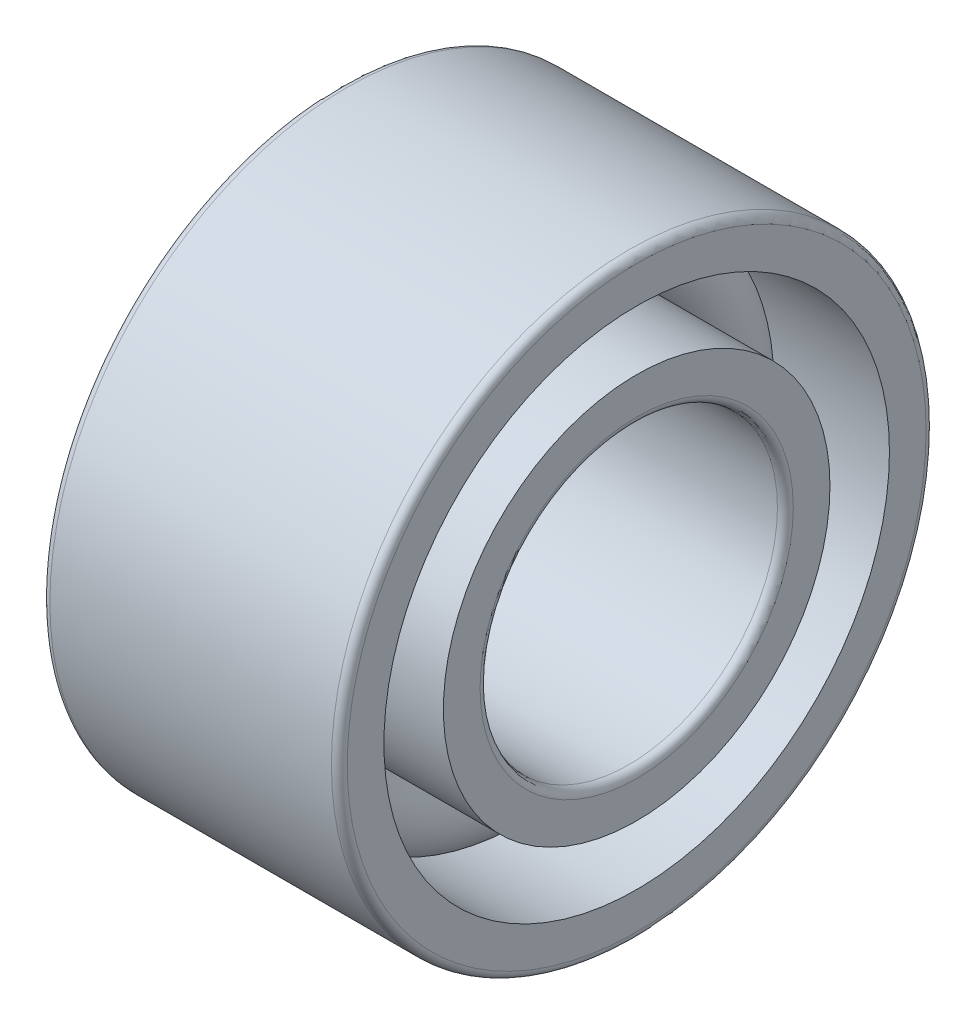
ISO-10303-21;
HEADER;
FILE_DESCRIPTION(('STEP AP214'),'2;1');
FILE_NAME('part.step','',(''),(''),'','','');
FILE_SCHEMA(('AUTOMOTIVE_DESIGN { 1 0 10303 214 1 1 1 1 }'));
ENDSEC;
DATA;
#1=APPLICATION_CONTEXT('core data for automotive mechanical design processes');
#2=APPLICATION_PROTOCOL_DEFINITION('international standard','automotive_design',2000,#1);
#3=PRODUCT_CONTEXT('',#1,'mechanical');
#4=PRODUCT('Part','Part','',(#3));
#5=PRODUCT_RELATED_PRODUCT_CATEGORY('part','',(#4));
#6=PRODUCT_DEFINITION_FORMATION('','',#4);
#7=PRODUCT_DEFINITION_CONTEXT('part definition',#1,'design');
#8=PRODUCT_DEFINITION('design','',#6,#7);
#9=PRODUCT_DEFINITION_SHAPE('','',#8);
#10=(LENGTH_UNIT() NAMED_UNIT(*) SI_UNIT(.MILLI.,.METRE.));
#11=(NAMED_UNIT(*) PLANE_ANGLE_UNIT() SI_UNIT($,.RADIAN.));
#12=(NAMED_UNIT(*) SI_UNIT($,.STERADIAN.) SOLID_ANGLE_UNIT());
#13=UNCERTAINTY_MEASURE_WITH_UNIT(LENGTH_MEASURE(1.E-05),#10,'distance_accuracy_value','');
#14=(GEOMETRIC_REPRESENTATION_CONTEXT(3) GLOBAL_UNCERTAINTY_ASSIGNED_CONTEXT((#13)) GLOBAL_UNIT_ASSIGNED_CONTEXT((#10,
#11,#12)) REPRESENTATION_CONTEXT('',''));
#15=CARTESIAN_POINT('',(0.,0.,0.));
#16=DIRECTION('',(0.,0.,1.));
#17=DIRECTION('',(1.,0.,0.));
#18=AXIS2_PLACEMENT_3D('',#15,#16,#17);
#19=CARTESIAN_POINT('',(0.,0.,0.));
#20=DIRECTION('',(-1.,0.,0.));
#21=DIRECTION('',(0.,0.,1.));
#22=AXIS2_PLACEMENT_3D('',#19,#20,#21);
#23=TOROIDAL_SURFACE('',#22,2.25,0.45);
#24=CARTESIAN_POINT('',(0.335410196624964,0.,0.));
#25=DIRECTION('',(-1.,0.,0.));
#26=DIRECTION('',(0.,0.,1.));
#27=AXIS2_PLACEMENT_3D('',#24,#25,#26);
#28=CIRCLE('',#27,2.55);
#29=CARTESIAN_POINT('',(0.335410196624964,0.,2.55));
#30=VERTEX_POINT('',#29);
#31=EDGE_CURVE('E35',#30,#30,#28,.F.);
#32=ORIENTED_EDGE('',*,*,#31,.T.);
#33=EDGE_LOOP('',(#32));
#34=FACE_BOUND('',#33,.T.);
#35=CARTESIAN_POINT('',(0.335410196624968,0.,0.));
#36=DIRECTION('',(-1.,0.,0.));
#37=DIRECTION('',(0.,0.,1.));
#38=AXIS2_PLACEMENT_3D('',#35,#36,#37);
#39=CIRCLE('',#38,1.95);
#40=CARTESIAN_POINT('',(0.335410196624968,0.,1.95));
#41=VERTEX_POINT('',#40);
#42=EDGE_CURVE('E10',#41,#41,#39,.T.);
#43=ORIENTED_EDGE('',*,*,#42,.T.);
#44=EDGE_LOOP('',(#43));
#45=FACE_BOUND('',#44,.T.);
#46=ADVANCED_FACE('F31',(#34,#45),#23,.T.);
#47=CARTESIAN_POINT('',(-20.6375,0.,0.));
#48=DIRECTION('',(1.,0.,0.));
#49=DIRECTION('',(0.,0.,-1.));
#50=AXIS2_PLACEMENT_3D('',#47,#48,#49);
#51=CYLINDRICAL_SURFACE('',#50,1.95);
#52=CARTESIAN_POINT('',(1.5,0.,0.));
#53=DIRECTION('',(1.,0.,0.));
#54=DIRECTION('',(0.,0.,-1.));
#55=AXIS2_PLACEMENT_3D('',#52,#53,#54);
#56=CIRCLE('',#55,1.95);
#57=CARTESIAN_POINT('',(1.5,0.,-1.95));
#58=VERTEX_POINT('',#57);
#59=EDGE_CURVE('E44',#58,#58,#56,.T.);
#60=ORIENTED_EDGE('',*,*,#59,.F.);
#61=EDGE_LOOP('',(#60));
#62=FACE_BOUND('',#61,.T.);
#63=ORIENTED_EDGE('',*,*,#42,.F.);
#64=EDGE_LOOP('',(#63));
#65=FACE_BOUND('',#64,.T.);
#66=ADVANCED_FACE('F83',(#62,#65),#51,.T.);
#67=CARTESIAN_POINT('',(-20.6375,0.,0.));
#68=DIRECTION('',(1.,0.,0.));
#69=DIRECTION('',(0.,0.,-1.));
#70=AXIS2_PLACEMENT_3D('',#67,#68,#69);
#71=CYLINDRICAL_SURFACE('',#70,1.95);
#72=CARTESIAN_POINT('',(-1.5,0.,0.));
#73=DIRECTION('',(1.,0.,0.));
#74=DIRECTION('',(0.,0.,-1.));
#75=AXIS2_PLACEMENT_3D('',#72,#73,#74);
#76=CIRCLE('',#75,1.95);
#77=CARTESIAN_POINT('',(-1.5,0.,-1.95));
#78=VERTEX_POINT('',#77);
#79=EDGE_CURVE('E53',#78,#78,#76,.T.);
#80=ORIENTED_EDGE('',*,*,#79,.T.);
#81=EDGE_LOOP('',(#80));
#82=FACE_BOUND('',#81,.T.);
#83=CARTESIAN_POINT('',(-0.335410196624968,0.,0.));
#84=DIRECTION('',(1.,0.,0.));
#85=DIRECTION('',(0.,0.,-1.));
#86=AXIS2_PLACEMENT_3D('',#83,#84,#85);
#87=CIRCLE('',#86,1.95);
#88=CARTESIAN_POINT('',(-0.335410196624968,0.,-1.95));
#89=VERTEX_POINT('',#88);
#90=EDGE_CURVE('E39',#89,#89,#87,.T.);
#91=ORIENTED_EDGE('',*,*,#90,.F.);
#92=EDGE_LOOP('',(#91));
#93=FACE_BOUND('',#92,.T.);
#94=ADVANCED_FACE('F86',(#82,#93),#71,.T.);
#95=CARTESIAN_POINT('',(1.5,1.58,0.));
#96=DIRECTION('',(1.,0.,0.));
#97=DIRECTION('',(0.,0.,-1.));
#98=AXIS2_PLACEMENT_3D('',#95,#96,#97);
#99=PLANE('',#98);
#100=ORIENTED_EDGE('',*,*,#59,.T.);
#101=EDGE_LOOP('',(#100));
#102=FACE_BOUND('',#101,.T.);
#103=CARTESIAN_POINT('',(1.5,0.,0.));
#104=DIRECTION('',(1.,0.,0.));
#105=DIRECTION('',(0.,0.,-1.));
#106=AXIS2_PLACEMENT_3D('',#103,#104,#105);
#107=CIRCLE('',#106,1.58);
#108=CARTESIAN_POINT('',(1.5,0.,-1.58));
#109=VERTEX_POINT('',#108);
#110=EDGE_CURVE('E75',#109,#109,#107,.T.);
#111=ORIENTED_EDGE('',*,*,#110,.F.);
#112=EDGE_LOOP('',(#111));
#113=FACE_BOUND('',#112,.T.);
#114=ADVANCED_FACE('F80',(#102,#113),#99,.T.);
#115=CARTESIAN_POINT('',(1.42,0.,0.));
#116=DIRECTION('',(1.,0.,0.));
#117=DIRECTION('',(0.,0.,-1.));
#118=AXIS2_PLACEMENT_3D('',#115,#116,#117);
#119=TOROIDAL_SURFACE('',#118,1.58,0.0800000000000001);
#120=ORIENTED_EDGE('',*,*,#110,.T.);
#121=EDGE_LOOP('',(#120));
#122=FACE_BOUND('',#121,.T.);
#123=CARTESIAN_POINT('',(1.42,0.,0.));
#124=DIRECTION('',(1.,0.,0.));
#125=DIRECTION('',(0.,0.,-1.));
#126=AXIS2_PLACEMENT_3D('',#123,#124,#125);
#127=CIRCLE('',#126,1.5);
#128=CARTESIAN_POINT('',(1.42,0.,-1.5));
#129=VERTEX_POINT('',#128);
#130=EDGE_CURVE('E72',#129,#129,#127,.T.);
#131=ORIENTED_EDGE('',*,*,#130,.F.);
#132=EDGE_LOOP('',(#131));
#133=FACE_BOUND('',#132,.T.);
#134=ADVANCED_FACE('F97',(#122,#133),#119,.T.);
#135=CARTESIAN_POINT('',(-20.6375,0.,0.));
#136=DIRECTION('',(1.,0.,0.));
#137=DIRECTION('',(0.,0.,-1.));
#138=AXIS2_PLACEMENT_3D('',#135,#136,#137);
#139=CYLINDRICAL_SURFACE('',#138,1.5);
#140=ORIENTED_EDGE('',*,*,#130,.T.);
#141=EDGE_LOOP('',(#140));
#142=FACE_BOUND('',#141,.T.);
#143=CARTESIAN_POINT('',(-1.42,0.,0.));
#144=DIRECTION('',(1.,0.,0.));
#145=DIRECTION('',(0.,0.,-1.));
#146=AXIS2_PLACEMENT_3D('',#143,#144,#145);
#147=CIRCLE('',#146,1.5);
#148=CARTESIAN_POINT('',(-1.42,0.,-1.5));
#149=VERTEX_POINT('',#148);
#150=EDGE_CURVE('E69',#149,#149,#147,.T.);
#151=ORIENTED_EDGE('',*,*,#150,.F.);
#152=EDGE_LOOP('',(#151));
#153=FACE_BOUND('',#152,.T.);
#154=ADVANCED_FACE('F100',(#142,#153),#139,.F.);
#155=CARTESIAN_POINT('',(-1.42,0.,0.));
#156=DIRECTION('',(1.,0.,0.));
#157=DIRECTION('',(0.,0.,-1.));
#158=AXIS2_PLACEMENT_3D('',#155,#156,#157);
#159=TOROIDAL_SURFACE('',#158,1.58,0.0800000000000001);
#160=ORIENTED_EDGE('',*,*,#150,.T.);
#161=EDGE_LOOP('',(#160));
#162=FACE_BOUND('',#161,.T.);
#163=CARTESIAN_POINT('',(-1.5,0.,0.));
#164=DIRECTION('',(1.,0.,0.));
#165=DIRECTION('',(0.,0.,-1.));
#166=AXIS2_PLACEMENT_3D('',#163,#164,#165);
#167=CIRCLE('',#166,1.58);
#168=CARTESIAN_POINT('',(-1.5,0.,-1.58));
#169=VERTEX_POINT('',#168);
#170=EDGE_CURVE('E66',#169,#169,#167,.T.);
#171=ORIENTED_EDGE('',*,*,#170,.F.);
#172=EDGE_LOOP('',(#171));
#173=FACE_BOUND('',#172,.T.);
#174=ADVANCED_FACE('F104',(#162,#173),#159,.T.);
#175=CARTESIAN_POINT('',(-1.5,1.95,0.));
#176=DIRECTION('',(-1.,0.,0.));
#177=DIRECTION('',(0.,0.,1.));
#178=AXIS2_PLACEMENT_3D('',#175,#176,#177);
#179=PLANE('',#178);
#180=ORIENTED_EDGE('',*,*,#170,.T.);
#181=EDGE_LOOP('',(#180));
#182=FACE_BOUND('',#181,.T.);
#183=ORIENTED_EDGE('',*,*,#79,.F.);
#184=EDGE_LOOP('',(#183));
#185=FACE_BOUND('',#184,.T.);
#186=ADVANCED_FACE('F108',(#182,#185),#179,.T.);
#187=CARTESIAN_POINT('',(-0.335410196624964,0.,0.));
#188=DIRECTION('',(1.,0.,0.));
#189=DIRECTION('',(0.,0.,-1.));
#190=AXIS2_PLACEMENT_3D('',#187,#188,#189);
#191=CIRCLE('',#190,2.55);
#192=CARTESIAN_POINT('',(-0.335410196624964,0.,-2.55));
#193=VERTEX_POINT('',#192);
#194=EDGE_CURVE('E47',#193,#193,#191,.F.);
#195=ORIENTED_EDGE('',*,*,#194,.T.);
#196=EDGE_LOOP('',(#195));
#197=FACE_BOUND('',#196,.T.);
#198=ORIENTED_EDGE('',*,*,#90,.T.);
#199=EDGE_LOOP('',(#198));
#200=FACE_BOUND('',#199,.T.);
#201=ADVANCED_FACE('F33',(#197,#200),#23,.T.);
#202=CARTESIAN_POINT('',(-20.6375,0.,0.));
#203=DIRECTION('',(1.,0.,0.));
#204=DIRECTION('',(0.,0.,-1.));
#205=AXIS2_PLACEMENT_3D('',#202,#203,#204);
#206=CYLINDRICAL_SURFACE('',#205,2.55);
#207=CARTESIAN_POINT('',(1.5,0.,0.));
#208=DIRECTION('',(1.,0.,0.));
#209=DIRECTION('',(0.,0.,-1.));
#210=AXIS2_PLACEMENT_3D('',#207,#208,#209);
#211=CIRCLE('',#210,2.55);
#212=CARTESIAN_POINT('',(1.5,0.,-2.55));
#213=VERTEX_POINT('',#212);
#214=EDGE_CURVE('E49',#213,#213,#211,.T.);
#215=ORIENTED_EDGE('',*,*,#214,.T.);
#216=EDGE_LOOP('',(#215));
#217=FACE_BOUND('',#216,.T.);
#218=ORIENTED_EDGE('',*,*,#31,.F.);
#219=EDGE_LOOP('',(#218));
#220=FACE_BOUND('',#219,.T.);
#221=ADVANCED_FACE('F113',(#217,#220),#206,.F.);
#222=CARTESIAN_POINT('',(-20.6375,0.,0.));
#223=DIRECTION('',(1.,0.,0.));
#224=DIRECTION('',(0.,0.,-1.));
#225=AXIS2_PLACEMENT_3D('',#222,#223,#224);
#226=CYLINDRICAL_SURFACE('',#225,2.55);
#227=CARTESIAN_POINT('',(-1.5,0.,0.));
#228=DIRECTION('',(1.,0.,0.));
#229=DIRECTION('',(0.,0.,-1.));
#230=AXIS2_PLACEMENT_3D('',#227,#228,#229);
#231=CIRCLE('',#230,2.55);
#232=CARTESIAN_POINT('',(-1.5,0.,-2.55));
#233=VERTEX_POINT('',#232);
#234=EDGE_CURVE('E144',#233,#233,#231,.T.);
#235=ORIENTED_EDGE('',*,*,#234,.F.);
#236=EDGE_LOOP('',(#235));
#237=FACE_BOUND('',#236,.T.);
#238=ORIENTED_EDGE('',*,*,#194,.F.);
#239=EDGE_LOOP('',(#238));
#240=FACE_BOUND('',#239,.T.);
#241=ADVANCED_FACE('F116',(#237,#240),#226,.F.);
#242=CARTESIAN_POINT('',(1.5,2.92000000000001,0.));
#243=DIRECTION('',(1.,0.,0.));
#244=DIRECTION('',(0.,0.,-1.));
#245=AXIS2_PLACEMENT_3D('',#242,#243,#244);
#246=PLANE('',#245);
#247=CARTESIAN_POINT('',(1.5,0.,0.));
#248=DIRECTION('',(1.,0.,0.));
#249=DIRECTION('',(0.,0.,-1.));
#250=AXIS2_PLACEMENT_3D('',#247,#248,#249);
#251=CIRCLE('',#250,2.92000000000001);
#252=CARTESIAN_POINT('',(1.5,0.,-2.92000000000001));
#253=VERTEX_POINT('',#252);
#254=EDGE_CURVE('E55',#253,#253,#251,.T.);
#255=ORIENTED_EDGE('',*,*,#254,.T.);
#256=EDGE_LOOP('',(#255));
#257=FACE_BOUND('',#256,.T.);
#258=ORIENTED_EDGE('',*,*,#214,.F.);
#259=EDGE_LOOP('',(#258));
#260=FACE_BOUND('',#259,.T.);
#261=ADVANCED_FACE('F117',(#257,#260),#246,.T.);
#262=CARTESIAN_POINT('',(1.42,0.,0.));
#263=DIRECTION('',(1.,0.,0.));
#264=DIRECTION('',(0.,0.,-1.));
#265=AXIS2_PLACEMENT_3D('',#262,#263,#264);
#266=TOROIDAL_SURFACE('',#265,2.92000000000001,0.0800000000000001);
#267=CARTESIAN_POINT('',(1.42,0.,0.));
#268=DIRECTION('',(1.,0.,0.));
#269=DIRECTION('',(0.,0.,-1.));
#270=AXIS2_PLACEMENT_3D('',#267,#268,#269);
#271=CIRCLE('',#270,3.00000000000001);
#272=CARTESIAN_POINT('',(1.42,0.,-3.00000000000001));
#273=VERTEX_POINT('',#272);
#274=EDGE_CURVE('E60',#273,#273,#271,.T.);
#275=ORIENTED_EDGE('',*,*,#274,.T.);
#276=EDGE_LOOP('',(#275));
#277=FACE_BOUND('',#276,.T.);
#278=ORIENTED_EDGE('',*,*,#254,.F.);
#279=EDGE_LOOP('',(#278));
#280=FACE_BOUND('',#279,.T.);
#281=ADVANCED_FACE('F120',(#277,#280),#266,.T.);
#282=CARTESIAN_POINT('',(-20.6375,0.,0.));
#283=DIRECTION('',(1.,0.,0.));
#284=DIRECTION('',(0.,0.,-1.));
#285=AXIS2_PLACEMENT_3D('',#282,#283,#284);
#286=CYLINDRICAL_SURFACE('',#285,3.00000000000001);
#287=CARTESIAN_POINT('',(-1.42,0.,0.));
#288=DIRECTION('',(1.,0.,0.));
#289=DIRECTION('',(0.,0.,-1.));
#290=AXIS2_PLACEMENT_3D('',#287,#288,#289);
#291=CIRCLE('',#290,3.00000000000001);
#292=CARTESIAN_POINT('',(-1.42,0.,-3.00000000000001));
#293=VERTEX_POINT('',#292);
#294=EDGE_CURVE('E148',#293,#293,#291,.T.);
#295=ORIENTED_EDGE('',*,*,#294,.T.);
#296=EDGE_LOOP('',(#295));
#297=FACE_BOUND('',#296,.T.);
#298=ORIENTED_EDGE('',*,*,#274,.F.);
#299=EDGE_LOOP('',(#298));
#300=FACE_BOUND('',#299,.T.);
#301=ADVANCED_FACE('F124',(#297,#300),#286,.T.);
#302=CARTESIAN_POINT('',(-1.42,0.,0.));
#303=DIRECTION('',(1.,0.,0.));
#304=DIRECTION('',(0.,0.,-1.));
#305=AXIS2_PLACEMENT_3D('',#302,#303,#304);
#306=TOROIDAL_SURFACE('',#305,2.92000000000001,0.0800000000000001);
#307=CARTESIAN_POINT('',(-1.5,0.,0.));
#308=DIRECTION('',(1.,0.,0.));
#309=DIRECTION('',(0.,0.,-1.));
#310=AXIS2_PLACEMENT_3D('',#307,#308,#309);
#311=CIRCLE('',#310,2.92000000000001);
#312=CARTESIAN_POINT('',(-1.5,0.,-2.92000000000001));
#313=VERTEX_POINT('',#312);
#314=EDGE_CURVE('E145',#313,#313,#311,.T.);
#315=ORIENTED_EDGE('',*,*,#314,.T.);
#316=EDGE_LOOP('',(#315));
#317=FACE_BOUND('',#316,.T.);
#318=ORIENTED_EDGE('',*,*,#294,.F.);
#319=EDGE_LOOP('',(#318));
#320=FACE_BOUND('',#319,.T.);
#321=ADVANCED_FACE('F128',(#317,#320),#306,.T.);
#322=CARTESIAN_POINT('',(-1.5,2.55,0.));
#323=DIRECTION('',(-1.,0.,0.));
#324=DIRECTION('',(0.,0.,1.));
#325=AXIS2_PLACEMENT_3D('',#322,#323,#324);
#326=PLANE('',#325);
#327=ORIENTED_EDGE('',*,*,#234,.T.);
#328=EDGE_LOOP('',(#327));
#329=FACE_BOUND('',#328,.T.);
#330=ORIENTED_EDGE('',*,*,#314,.F.);
#331=EDGE_LOOP('',(#330));
#332=FACE_BOUND('',#331,.T.);
#333=ADVANCED_FACE('F132',(#329,#332),#326,.T.);
#334=CLOSED_SHELL('',(#46,#66,#94,#114,#134,#154,#174,#186,#201,#221,#241,#261,#281,#301,#321,#333));
#335=MANIFOLD_SOLID_BREP('B2',#334);
#336=ADVANCED_BREP_SHAPE_REPRESENTATION('',(#18,#335),#14);
#337=SHAPE_DEFINITION_REPRESENTATION(#9,#336);
ENDSEC;
END-ISO-10303-21;
